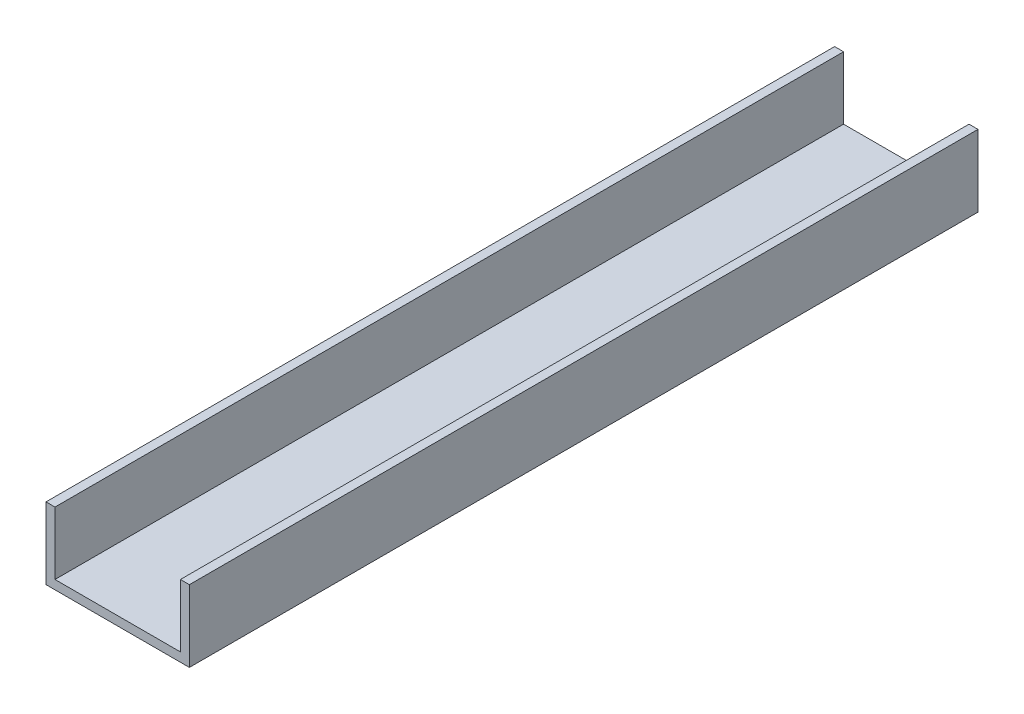
ISO-10303-21;
HEADER;
FILE_DESCRIPTION(('STEP AP214'),'2;1');
FILE_NAME('part.step','',(''),(''),'','','');
FILE_SCHEMA(('AUTOMOTIVE_DESIGN { 1 0 10303 214 1 1 1 1 }'));
ENDSEC;
DATA;
#1=APPLICATION_CONTEXT('core data for automotive mechanical design processes');
#2=APPLICATION_PROTOCOL_DEFINITION('international standard','automotive_design',2000,#1);
#3=PRODUCT_CONTEXT('',#1,'mechanical');
#4=PRODUCT('Part','Part','',(#3));
#5=PRODUCT_RELATED_PRODUCT_CATEGORY('part','',(#4));
#6=PRODUCT_DEFINITION_FORMATION('','',#4);
#7=PRODUCT_DEFINITION_CONTEXT('part definition',#1,'design');
#8=PRODUCT_DEFINITION('design','',#6,#7);
#9=PRODUCT_DEFINITION_SHAPE('','',#8);
#10=(LENGTH_UNIT() NAMED_UNIT(*) SI_UNIT(.MILLI.,.METRE.));
#11=(NAMED_UNIT(*) PLANE_ANGLE_UNIT() SI_UNIT($,.RADIAN.));
#12=(NAMED_UNIT(*) SI_UNIT($,.STERADIAN.) SOLID_ANGLE_UNIT());
#13=UNCERTAINTY_MEASURE_WITH_UNIT(LENGTH_MEASURE(1.E-05),#10,'distance_accuracy_value','');
#14=(GEOMETRIC_REPRESENTATION_CONTEXT(3) GLOBAL_UNCERTAINTY_ASSIGNED_CONTEXT((#13)) GLOBAL_UNIT_ASSIGNED_CONTEXT((#10,
#11,#12)) REPRESENTATION_CONTEXT('',''));
#15=CARTESIAN_POINT('',(0.,0.,0.));
#16=DIRECTION('',(0.,0.,1.));
#17=DIRECTION('',(1.,0.,0.));
#18=AXIS2_PLACEMENT_3D('',#15,#16,#17);
#19=CARTESIAN_POINT('',(0.,0.,279.4));
#20=DIRECTION('',(1.,0.,0.));
#21=DIRECTION('',(0.,0.,-1.));
#22=AXIS2_PLACEMENT_3D('',#19,#20,#21);
#23=PLANE('',#22);
#24=DIRECTION('',(0.,-1.,0.));
#25=VECTOR('',#24,1.);
#26=CARTESIAN_POINT('',(0.,0.,0.));
#27=LINE('',#26,#25);
#28=CARTESIAN_POINT('',(0.,25.4,0.));
#29=VERTEX_POINT('',#28);
#30=CARTESIAN_POINT('',(0.,0.,0.));
#31=VERTEX_POINT('',#30);
#32=EDGE_CURVE('E135',#29,#31,#27,.T.);
#33=ORIENTED_EDGE('',*,*,#32,.T.);
#34=DIRECTION('',(0.,0.,-1.));
#35=VECTOR('',#34,1.);
#36=CARTESIAN_POINT('',(0.,0.,279.4));
#37=LINE('',#36,#35);
#38=CARTESIAN_POINT('',(0.,0.,279.4));
#39=VERTEX_POINT('',#38);
#40=EDGE_CURVE('E11',#39,#31,#37,.T.);
#41=ORIENTED_EDGE('',*,*,#40,.F.);
#42=DIRECTION('',(0.,-1.,0.));
#43=VECTOR('',#42,1.);
#44=CARTESIAN_POINT('',(0.,0.,279.4));
#45=LINE('',#44,#43);
#46=CARTESIAN_POINT('',(0.,25.4,279.4));
#47=VERTEX_POINT('',#46);
#48=EDGE_CURVE('E151',#47,#39,#45,.T.);
#49=ORIENTED_EDGE('',*,*,#48,.F.);
#50=DIRECTION('',(0.,0.,-1.));
#51=VECTOR('',#50,1.);
#52=CARTESIAN_POINT('',(0.,25.4,279.4));
#53=LINE('',#52,#51);
#54=EDGE_CURVE('E131',#47,#29,#53,.T.);
#55=ORIENTED_EDGE('',*,*,#54,.T.);
#56=EDGE_LOOP('',(#33,#41,#49,#55));
#57=FACE_BOUND('',#56,.T.);
#58=ADVANCED_FACE('F36',(#57),#23,.F.);
#59=CARTESIAN_POINT('',(0.,0.,279.4));
#60=DIRECTION('',(0.,1.,0.));
#61=DIRECTION('',(0.,0.,1.));
#62=AXIS2_PLACEMENT_3D('',#59,#60,#61);
#63=PLANE('',#62);
#64=DIRECTION('',(1.,0.,0.));
#65=VECTOR('',#64,1.);
#66=CARTESIAN_POINT('',(0.,0.,0.));
#67=LINE('',#66,#65);
#68=CARTESIAN_POINT('',(50.8,0.,0.));
#69=VERTEX_POINT('',#68);
#70=EDGE_CURVE('E139',#31,#69,#67,.T.);
#71=ORIENTED_EDGE('',*,*,#70,.T.);
#72=DIRECTION('',(0.,0.,-1.));
#73=VECTOR('',#72,1.);
#74=CARTESIAN_POINT('',(50.8,0.,279.4));
#75=LINE('',#74,#73);
#76=CARTESIAN_POINT('',(50.8,0.,279.4));
#77=VERTEX_POINT('',#76);
#78=EDGE_CURVE('E45',#77,#69,#75,.T.);
#79=ORIENTED_EDGE('',*,*,#78,.F.);
#80=DIRECTION('',(1.,0.,0.));
#81=VECTOR('',#80,1.);
#82=CARTESIAN_POINT('',(0.,0.,279.4));
#83=LINE('',#82,#81);
#84=EDGE_CURVE('E97',#39,#77,#83,.T.);
#85=ORIENTED_EDGE('',*,*,#84,.F.);
#86=ORIENTED_EDGE('',*,*,#40,.T.);
#87=EDGE_LOOP('',(#71,#79,#85,#86));
#88=FACE_BOUND('',#87,.T.);
#89=ADVANCED_FACE('F190',(#88),#63,.F.);
#90=CARTESIAN_POINT('',(50.8,0.,279.4));
#91=DIRECTION('',(-1.,0.,0.));
#92=DIRECTION('',(0.,0.,1.));
#93=AXIS2_PLACEMENT_3D('',#90,#91,#92);
#94=PLANE('',#93);
#95=DIRECTION('',(0.,1.,0.));
#96=VECTOR('',#95,1.);
#97=CARTESIAN_POINT('',(50.8,0.,0.));
#98=LINE('',#97,#96);
#99=CARTESIAN_POINT('',(50.8,25.4,0.));
#100=VERTEX_POINT('',#99);
#101=EDGE_CURVE('E142',#69,#100,#98,.T.);
#102=ORIENTED_EDGE('',*,*,#101,.T.);
#103=DIRECTION('',(0.,0.,-1.));
#104=VECTOR('',#103,1.);
#105=CARTESIAN_POINT('',(50.8,25.4,279.4));
#106=LINE('',#105,#104);
#107=CARTESIAN_POINT('',(50.8,25.4,279.4));
#108=VERTEX_POINT('',#107);
#109=EDGE_CURVE('E160',#108,#100,#106,.T.);
#110=ORIENTED_EDGE('',*,*,#109,.F.);
#111=DIRECTION('',(0.,1.,0.));
#112=VECTOR('',#111,1.);
#113=CARTESIAN_POINT('',(50.8,0.,279.4));
#114=LINE('',#113,#112);
#115=EDGE_CURVE('E170',#77,#108,#114,.T.);
#116=ORIENTED_EDGE('',*,*,#115,.F.);
#117=ORIENTED_EDGE('',*,*,#78,.T.);
#118=EDGE_LOOP('',(#102,#110,#116,#117));
#119=FACE_BOUND('',#118,.T.);
#120=ADVANCED_FACE('F168',(#119),#94,.F.);
#121=CARTESIAN_POINT('',(47.625,25.4,279.4));
#122=DIRECTION('',(0.,-1.,0.));
#123=DIRECTION('',(0.,0.,-1.));
#124=AXIS2_PLACEMENT_3D('',#121,#122,#123);
#125=PLANE('',#124);
#126=DIRECTION('',(-1.,0.,0.));
#127=VECTOR('',#126,1.);
#128=CARTESIAN_POINT('',(47.625,25.4,0.));
#129=LINE('',#128,#127);
#130=CARTESIAN_POINT('',(47.625,25.4,0.));
#131=VERTEX_POINT('',#130);
#132=EDGE_CURVE('E144',#100,#131,#129,.T.);
#133=ORIENTED_EDGE('',*,*,#132,.T.);
#134=DIRECTION('',(0.,0.,-1.));
#135=VECTOR('',#134,1.);
#136=CARTESIAN_POINT('',(47.625,25.4,279.4));
#137=LINE('',#136,#135);
#138=CARTESIAN_POINT('',(47.625,25.4,279.4));
#139=VERTEX_POINT('',#138);
#140=EDGE_CURVE('E156',#139,#131,#137,.T.);
#141=ORIENTED_EDGE('',*,*,#140,.F.);
#142=DIRECTION('',(-1.,0.,0.));
#143=VECTOR('',#142,1.);
#144=CARTESIAN_POINT('',(47.625,25.4,279.4));
#145=LINE('',#144,#143);
#146=EDGE_CURVE('E182',#108,#139,#145,.T.);
#147=ORIENTED_EDGE('',*,*,#146,.F.);
#148=ORIENTED_EDGE('',*,*,#109,.T.);
#149=EDGE_LOOP('',(#133,#141,#147,#148));
#150=FACE_BOUND('',#149,.T.);
#151=ADVANCED_FACE('F178',(#150),#125,.F.);
#152=CARTESIAN_POINT('',(47.625,3.175,279.4));
#153=DIRECTION('',(1.,0.,0.));
#154=DIRECTION('',(0.,0.,-1.));
#155=AXIS2_PLACEMENT_3D('',#152,#153,#154);
#156=PLANE('',#155);
#157=DIRECTION('',(0.,-1.,0.));
#158=VECTOR('',#157,1.);
#159=CARTESIAN_POINT('',(47.625,3.175,0.));
#160=LINE('',#159,#158);
#161=CARTESIAN_POINT('',(47.625,3.175,0.));
#162=VERTEX_POINT('',#161);
#163=EDGE_CURVE('E146',#131,#162,#160,.T.);
#164=ORIENTED_EDGE('',*,*,#163,.T.);
#165=DIRECTION('',(0.,0.,-1.));
#166=VECTOR('',#165,1.);
#167=CARTESIAN_POINT('',(47.625,3.175,279.4));
#168=LINE('',#167,#166);
#169=CARTESIAN_POINT('',(47.625,3.175,279.4));
#170=VERTEX_POINT('',#169);
#171=EDGE_CURVE('E126',#170,#162,#168,.T.);
#172=ORIENTED_EDGE('',*,*,#171,.F.);
#173=DIRECTION('',(0.,-1.,0.));
#174=VECTOR('',#173,1.);
#175=CARTESIAN_POINT('',(47.625,3.175,279.4));
#176=LINE('',#175,#174);
#177=EDGE_CURVE('E116',#139,#170,#176,.T.);
#178=ORIENTED_EDGE('',*,*,#177,.F.);
#179=ORIENTED_EDGE('',*,*,#140,.T.);
#180=EDGE_LOOP('',(#164,#172,#178,#179));
#181=FACE_BOUND('',#180,.T.);
#182=ADVANCED_FACE('F181',(#181),#156,.F.);
#183=CARTESIAN_POINT('',(3.175,3.175,279.4));
#184=DIRECTION('',(0.,-1.,0.));
#185=DIRECTION('',(0.,0.,-1.));
#186=AXIS2_PLACEMENT_3D('',#183,#184,#185);
#187=PLANE('',#186);
#188=DIRECTION('',(-1.,0.,0.));
#189=VECTOR('',#188,1.);
#190=CARTESIAN_POINT('',(3.175,3.175,0.));
#191=LINE('',#190,#189);
#192=CARTESIAN_POINT('',(3.175,3.175,0.));
#193=VERTEX_POINT('',#192);
#194=EDGE_CURVE('E124',#162,#193,#191,.T.);
#195=ORIENTED_EDGE('',*,*,#194,.T.);
#196=DIRECTION('',(0.,0.,-1.));
#197=VECTOR('',#196,1.);
#198=CARTESIAN_POINT('',(3.175,3.175,279.4));
#199=LINE('',#198,#197);
#200=CARTESIAN_POINT('',(3.175,3.175,279.4));
#201=VERTEX_POINT('',#200);
#202=EDGE_CURVE('E121',#201,#193,#199,.T.);
#203=ORIENTED_EDGE('',*,*,#202,.F.);
#204=DIRECTION('',(-1.,0.,0.));
#205=VECTOR('',#204,1.);
#206=CARTESIAN_POINT('',(3.175,3.175,279.4));
#207=LINE('',#206,#205);
#208=EDGE_CURVE('E110',#170,#201,#207,.T.);
#209=ORIENTED_EDGE('',*,*,#208,.F.);
#210=ORIENTED_EDGE('',*,*,#171,.T.);
#211=EDGE_LOOP('',(#195,#203,#209,#210));
#212=FACE_BOUND('',#211,.T.);
#213=ADVANCED_FACE('F122',(#212),#187,.F.);
#214=CARTESIAN_POINT('',(3.175,3.175,279.4));
#215=DIRECTION('',(-1.,0.,0.));
#216=DIRECTION('',(0.,-1.,0.));
#217=AXIS2_PLACEMENT_3D('',#214,#215,#216);
#218=PLANE('',#217);
#219=DIRECTION('',(0.,1.,0.));
#220=VECTOR('',#219,1.);
#221=CARTESIAN_POINT('',(3.175,3.175,0.));
#222=LINE('',#221,#220);
#223=CARTESIAN_POINT('',(3.175,25.4,0.));
#224=VERTEX_POINT('',#223);
#225=EDGE_CURVE('E83',#193,#224,#222,.T.);
#226=ORIENTED_EDGE('',*,*,#225,.T.);
#227=DIRECTION('',(0.,0.,-1.));
#228=VECTOR('',#227,1.);
#229=CARTESIAN_POINT('',(3.175,25.4,279.4));
#230=LINE('',#229,#228);
#231=CARTESIAN_POINT('',(3.175,25.4,279.4));
#232=VERTEX_POINT('',#231);
#233=EDGE_CURVE('E127',#232,#224,#230,.T.);
#234=ORIENTED_EDGE('',*,*,#233,.F.);
#235=DIRECTION('',(0.,1.,0.));
#236=VECTOR('',#235,1.);
#237=CARTESIAN_POINT('',(3.175,3.175,279.4));
#238=LINE('',#237,#236);
#239=EDGE_CURVE('E114',#201,#232,#238,.T.);
#240=ORIENTED_EDGE('',*,*,#239,.F.);
#241=ORIENTED_EDGE('',*,*,#202,.T.);
#242=EDGE_LOOP('',(#226,#234,#240,#241));
#243=FACE_BOUND('',#242,.T.);
#244=ADVANCED_FACE('F129',(#243),#218,.F.);
#245=CARTESIAN_POINT('',(0.,25.4,279.4));
#246=DIRECTION('',(0.,-1.,0.));
#247=DIRECTION('',(0.,0.,-1.));
#248=AXIS2_PLACEMENT_3D('',#245,#246,#247);
#249=PLANE('',#248);
#250=DIRECTION('',(-1.,0.,0.));
#251=VECTOR('',#250,1.);
#252=CARTESIAN_POINT('',(0.,25.4,0.));
#253=LINE('',#252,#251);
#254=EDGE_CURVE('E89',#224,#29,#253,.T.);
#255=ORIENTED_EDGE('',*,*,#254,.T.);
#256=ORIENTED_EDGE('',*,*,#54,.F.);
#257=DIRECTION('',(-1.,0.,0.));
#258=VECTOR('',#257,1.);
#259=CARTESIAN_POINT('',(0.,25.4,279.4));
#260=LINE('',#259,#258);
#261=EDGE_CURVE('E53',#232,#47,#260,.T.);
#262=ORIENTED_EDGE('',*,*,#261,.F.);
#263=ORIENTED_EDGE('',*,*,#233,.T.);
#264=EDGE_LOOP('',(#255,#256,#262,#263));
#265=FACE_BOUND('',#264,.T.);
#266=ADVANCED_FACE('F206',(#265),#249,.F.);
#267=CARTESIAN_POINT('',(0.,0.,279.4));
#268=DIRECTION('',(0.,0.,-1.));
#269=DIRECTION('',(-1.,0.,0.));
#270=AXIS2_PLACEMENT_3D('',#267,#268,#269);
#271=PLANE('',#270);
#272=ORIENTED_EDGE('',*,*,#48,.T.);
#273=ORIENTED_EDGE('',*,*,#84,.T.);
#274=ORIENTED_EDGE('',*,*,#115,.T.);
#275=ORIENTED_EDGE('',*,*,#146,.T.);
#276=ORIENTED_EDGE('',*,*,#177,.T.);
#277=ORIENTED_EDGE('',*,*,#208,.T.);
#278=ORIENTED_EDGE('',*,*,#239,.T.);
#279=ORIENTED_EDGE('',*,*,#261,.T.);
#280=EDGE_LOOP('',(#272,#273,#274,#275,#276,#277,#278,#279));
#281=FACE_BOUND('',#280,.T.);
#282=ADVANCED_FACE('F112',(#281),#271,.F.);
#283=CARTESIAN_POINT('',(0.,0.,0.));
#284=DIRECTION('',(0.,0.,-1.));
#285=DIRECTION('',(-1.,0.,0.));
#286=AXIS2_PLACEMENT_3D('',#283,#284,#285);
#287=PLANE('',#286);
#288=ORIENTED_EDGE('',*,*,#32,.F.);
#289=ORIENTED_EDGE('',*,*,#254,.F.);
#290=ORIENTED_EDGE('',*,*,#225,.F.);
#291=ORIENTED_EDGE('',*,*,#194,.F.);
#292=ORIENTED_EDGE('',*,*,#163,.F.);
#293=ORIENTED_EDGE('',*,*,#132,.F.);
#294=ORIENTED_EDGE('',*,*,#101,.F.);
#295=ORIENTED_EDGE('',*,*,#70,.F.);
#296=EDGE_LOOP('',(#288,#289,#290,#291,#292,#293,#294,#295));
#297=FACE_BOUND('',#296,.T.);
#298=ADVANCED_FACE('F174',(#297),#287,.T.);
#299=CLOSED_SHELL('',(#58,#89,#120,#151,#182,#213,#244,#266,#282,#298));
#300=MANIFOLD_SOLID_BREP('B2',#299);
#301=ADVANCED_BREP_SHAPE_REPRESENTATION('',(#18,#300),#14);
#302=SHAPE_DEFINITION_REPRESENTATION(#9,#301);
ENDSEC;
END-ISO-10303-21;
